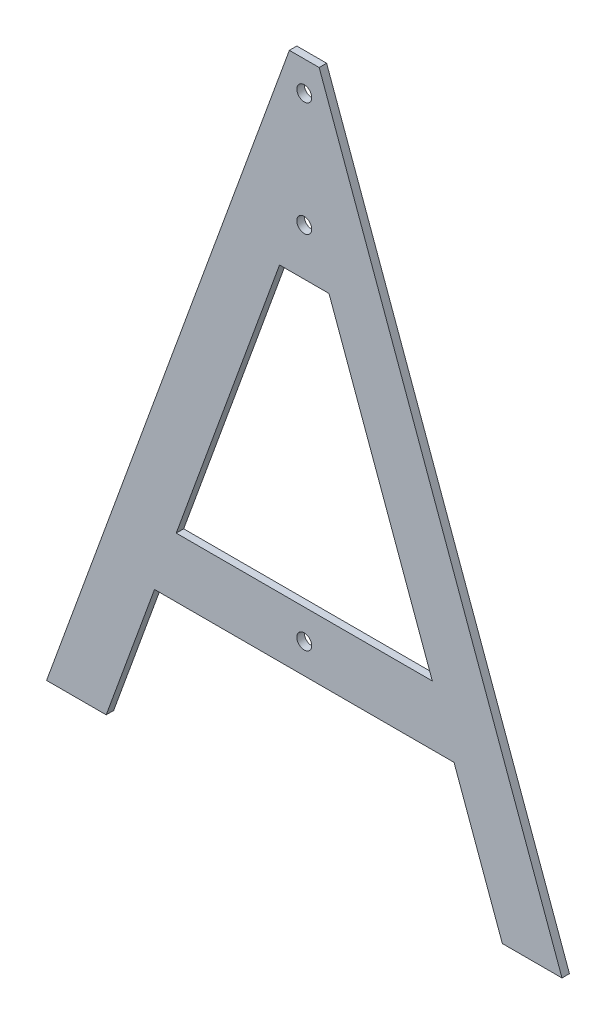
ISO-10303-21;
HEADER;
FILE_DESCRIPTION(('STEP AP214'),'2;1');
FILE_NAME('part.step','',(''),(''),'','','');
FILE_SCHEMA(('AUTOMOTIVE_DESIGN { 1 0 10303 214 1 1 1 1 }'));
ENDSEC;
DATA;
#1=APPLICATION_CONTEXT('core data for automotive mechanical design processes');
#2=APPLICATION_PROTOCOL_DEFINITION('international standard','automotive_design',2000,#1);
#3=PRODUCT_CONTEXT('',#1,'mechanical');
#4=PRODUCT('Part','Part','',(#3));
#5=PRODUCT_RELATED_PRODUCT_CATEGORY('part','',(#4));
#6=PRODUCT_DEFINITION_FORMATION('','',#4);
#7=PRODUCT_DEFINITION_CONTEXT('part definition',#1,'design');
#8=PRODUCT_DEFINITION('design','',#6,#7);
#9=PRODUCT_DEFINITION_SHAPE('','',#8);
#10=(LENGTH_UNIT() NAMED_UNIT(*) SI_UNIT(.MILLI.,.METRE.));
#11=(NAMED_UNIT(*) PLANE_ANGLE_UNIT() SI_UNIT($,.RADIAN.));
#12=(NAMED_UNIT(*) SI_UNIT($,.STERADIAN.) SOLID_ANGLE_UNIT());
#13=UNCERTAINTY_MEASURE_WITH_UNIT(LENGTH_MEASURE(1.E-05),#10,'distance_accuracy_value','');
#14=(GEOMETRIC_REPRESENTATION_CONTEXT(3) GLOBAL_UNCERTAINTY_ASSIGNED_CONTEXT((#13)) GLOBAL_UNIT_ASSIGNED_CONTEXT((#10,
#11,#12)) REPRESENTATION_CONTEXT('',''));
#15=CARTESIAN_POINT('',(0.,0.,0.));
#16=DIRECTION('',(0.,0.,1.));
#17=DIRECTION('',(1.,0.,0.));
#18=AXIS2_PLACEMENT_3D('',#15,#16,#17);
#19=CARTESIAN_POINT('',(0.,0.,3.175));
#20=DIRECTION('',(0.,0.,-1.));
#21=DIRECTION('',(-1.,0.,0.));
#22=AXIS2_PLACEMENT_3D('',#19,#20,#21);
#23=PLANE('',#22);
#24=CARTESIAN_POINT('',(0.,-48.55845,3.175));
#25=DIRECTION('',(0.,0.,1.));
#26=DIRECTION('',(1.,0.,0.));
#27=AXIS2_PLACEMENT_3D('',#24,#25,#26);
#28=CIRCLE('',#27,3.17500000000001);
#29=CARTESIAN_POINT('',(3.17500000000001,-48.55845,3.175));
#30=VERTEX_POINT('',#29);
#31=EDGE_CURVE('E180',#30,#30,#28,.T.);
#32=ORIENTED_EDGE('',*,*,#31,.F.);
#33=EDGE_LOOP('',(#32));
#34=FACE_BOUND('',#33,.T.);
#35=CARTESIAN_POINT('',(0.,0.,3.175));
#36=DIRECTION('',(0.,0.,1.));
#37=DIRECTION('',(1.,0.,0.));
#38=AXIS2_PLACEMENT_3D('',#35,#36,#37);
#39=CIRCLE('',#38,3.175);
#40=CARTESIAN_POINT('',(3.175,0.,3.175));
#41=VERTEX_POINT('',#40);
#42=EDGE_CURVE('E188',#41,#41,#39,.T.);
#43=ORIENTED_EDGE('',*,*,#42,.F.);
#44=EDGE_LOOP('',(#43));
#45=FACE_BOUND('',#44,.T.);
#46=DIRECTION('',(0.342020143325673,0.939692620785907,0.));
#47=VECTOR('',#46,1.);
#48=CARTESIAN_POINT('',(-84.3697580617083,-271.44345,3.175));
#49=LINE('',#48,#47);
#50=CARTESIAN_POINT('',(-84.3697580617083,-271.44345,3.175));
#51=VERTEX_POINT('',#50);
#52=CARTESIAN_POINT('',(-63.7859533311867,-214.889911296429,3.175));
#53=VERTEX_POINT('',#52);
#54=EDGE_CURVE('E196',#51,#53,#49,.T.);
#55=ORIENTED_EDGE('',*,*,#54,.T.);
#56=DIRECTION('',(1.,0.,0.));
#57=VECTOR('',#56,1.);
#58=CARTESIAN_POINT('',(-63.7859533311867,-214.889911296429,3.175));
#59=LINE('',#58,#57);
#60=CARTESIAN_POINT('',(63.7859533311867,-214.889911296429,3.175));
#61=VERTEX_POINT('',#60);
#62=EDGE_CURVE('E200',#53,#61,#59,.T.);
#63=ORIENTED_EDGE('',*,*,#62,.T.);
#64=DIRECTION('',(0.342020143325674,-0.939692620785907,0.));
#65=VECTOR('',#64,1.);
#66=CARTESIAN_POINT('',(84.3697580617084,-271.44345,3.175));
#67=LINE('',#66,#65);
#68=CARTESIAN_POINT('',(84.3697580617084,-271.44345,3.175));
#69=VERTEX_POINT('',#68);
#70=EDGE_CURVE('E204',#61,#69,#67,.T.);
#71=ORIENTED_EDGE('',*,*,#70,.T.);
#72=DIRECTION('',(1.,0.,0.));
#73=VECTOR('',#72,1.);
#74=CARTESIAN_POINT('',(109.769758061708,-271.44345,3.175));
#75=LINE('',#74,#73);
#76=CARTESIAN_POINT('',(109.769758061708,-271.44345,3.175));
#77=VERTEX_POINT('',#76);
#78=EDGE_CURVE('E207',#69,#77,#75,.T.);
#79=ORIENTED_EDGE('',*,*,#78,.T.);
#80=DIRECTION('',(-0.342020143325673,0.939692620785907,0.));
#81=VECTOR('',#80,1.);
#82=CARTESIAN_POINT('',(6.35,12.7,3.175));
#83=LINE('',#82,#81);
#84=CARTESIAN_POINT('',(6.35,12.7,3.175));
#85=VERTEX_POINT('',#84);
#86=EDGE_CURVE('E210',#77,#85,#83,.T.);
#87=ORIENTED_EDGE('',*,*,#86,.T.);
#88=DIRECTION('',(-1.,0.,0.));
#89=VECTOR('',#88,1.);
#90=CARTESIAN_POINT('',(6.35,12.7,3.175));
#91=LINE('',#90,#89);
#92=CARTESIAN_POINT('',(-6.35,12.7,3.175));
#93=VERTEX_POINT('',#92);
#94=EDGE_CURVE('E213',#85,#93,#91,.T.);
#95=ORIENTED_EDGE('',*,*,#94,.T.);
#96=DIRECTION('',(-0.342020143325673,-0.939692620785907,0.));
#97=VECTOR('',#96,1.);
#98=CARTESIAN_POINT('',(-6.35,12.7,3.175));
#99=LINE('',#98,#97);
#100=CARTESIAN_POINT('',(-109.769758061708,-271.44345,3.175));
#101=VERTEX_POINT('',#100);
#102=EDGE_CURVE('E216',#93,#101,#99,.T.);
#103=ORIENTED_EDGE('',*,*,#102,.T.);
#104=DIRECTION('',(1.,0.,0.));
#105=VECTOR('',#104,1.);
#106=CARTESIAN_POINT('',(-109.769758061708,-271.44345,3.175));
#107=LINE('',#106,#105);
#108=EDGE_CURVE('E219',#101,#51,#107,.T.);
#109=ORIENTED_EDGE('',*,*,#108,.T.);
#110=EDGE_LOOP('',(#55,#63,#71,#79,#87,#95,#103,#109));
#111=FACE_BOUND('',#110,.T.);
#112=DIRECTION('',(-1.,0.,0.));
#113=VECTOR('',#112,1.);
#114=CARTESIAN_POINT('',(-10.5276091176956,-68.5638131723228,3.175));
#115=LINE('',#114,#113);
#116=CARTESIAN_POINT('',(10.5276091176956,-68.5638131723228,3.175));
#117=VERTEX_POINT('',#116);
#118=CARTESIAN_POINT('',(-10.5276091176956,-68.5638131723228,3.175));
#119=VERTEX_POINT('',#118);
#120=EDGE_CURVE('E129',#117,#119,#115,.T.);
#121=ORIENTED_EDGE('',*,*,#120,.F.);
#122=DIRECTION('',(-0.342020143325673,0.939692620785907,0.));
#123=VECTOR('',#122,1.);
#124=CARTESIAN_POINT('',(54.5411093808251,-189.48991129643,3.175));
#125=LINE('',#124,#123);
#126=CARTESIAN_POINT('',(54.541109380825,-189.48991129643,3.175));
#127=VERTEX_POINT('',#126);
#128=EDGE_CURVE('E156',#127,#117,#125,.T.);
#129=ORIENTED_EDGE('',*,*,#128,.F.);
#130=DIRECTION('',(1.,0.,0.));
#131=VECTOR('',#130,1.);
#132=CARTESIAN_POINT('',(-54.541109380825,-189.48991129643,3.175));
#133=LINE('',#132,#131);
#134=CARTESIAN_POINT('',(-54.541109380825,-189.48991129643,3.175));
#135=VERTEX_POINT('',#134);
#136=EDGE_CURVE('E152',#135,#127,#133,.T.);
#137=ORIENTED_EDGE('',*,*,#136,.F.);
#138=DIRECTION('',(-0.342020143325672,-0.939692620785907,0.));
#139=VECTOR('',#138,1.);
#140=CARTESIAN_POINT('',(-54.541109380825,-189.48991129643,3.175));
#141=LINE('',#140,#139);
#142=EDGE_CURVE('E138',#119,#135,#141,.T.);
#143=ORIENTED_EDGE('',*,*,#142,.F.);
#144=EDGE_LOOP('',(#121,#129,#137,#143));
#145=FACE_BOUND('',#144,.T.);
#146=CARTESIAN_POINT('',(0.,-202.189911296429,3.175));
#147=DIRECTION('',(0.,0.,1.));
#148=DIRECTION('',(1.,0.,0.));
#149=AXIS2_PLACEMENT_3D('',#146,#147,#148);
#150=CIRCLE('',#149,3.17499999999999);
#151=CARTESIAN_POINT('',(3.17500000000001,-202.189911296429,3.175));
#152=VERTEX_POINT('',#151);
#153=EDGE_CURVE('E164',#152,#152,#150,.T.);
#154=ORIENTED_EDGE('',*,*,#153,.F.);
#155=EDGE_LOOP('',(#154));
#156=FACE_BOUND('',#155,.T.);
#157=ADVANCED_FACE('F39',(#34,#45,#111,#145,#156),#23,.F.);
#158=CARTESIAN_POINT('',(0.,0.,0.));
#159=DIRECTION('',(0.,0.,-1.));
#160=DIRECTION('',(-1.,0.,0.));
#161=AXIS2_PLACEMENT_3D('',#158,#159,#160);
#162=PLANE('',#161);
#163=DIRECTION('',(-0.342020143325673,0.939692620785907,0.));
#164=VECTOR('',#163,1.);
#165=CARTESIAN_POINT('',(54.5411093808251,-189.48991129643,0.));
#166=LINE('',#165,#164);
#167=CARTESIAN_POINT('',(54.5411093808251,-189.48991129643,0.));
#168=VERTEX_POINT('',#167);
#169=CARTESIAN_POINT('',(10.5276091176956,-68.5638131723228,0.));
#170=VERTEX_POINT('',#169);
#171=EDGE_CURVE('E139',#168,#170,#166,.T.);
#172=ORIENTED_EDGE('',*,*,#171,.T.);
#173=DIRECTION('',(-1.,0.,0.));
#174=VECTOR('',#173,1.);
#175=CARTESIAN_POINT('',(-10.5276091176956,-68.5638131723228,0.));
#176=LINE('',#175,#174);
#177=CARTESIAN_POINT('',(-10.5276091176956,-68.5638131723228,0.));
#178=VERTEX_POINT('',#177);
#179=EDGE_CURVE('E63',#170,#178,#176,.T.);
#180=ORIENTED_EDGE('',*,*,#179,.T.);
#181=DIRECTION('',(-0.342020143325672,-0.939692620785907,0.));
#182=VECTOR('',#181,1.);
#183=CARTESIAN_POINT('',(-54.541109380825,-189.48991129643,0.));
#184=LINE('',#183,#182);
#185=CARTESIAN_POINT('',(-54.541109380825,-189.48991129643,0.));
#186=VERTEX_POINT('',#185);
#187=EDGE_CURVE('E145',#178,#186,#184,.T.);
#188=ORIENTED_EDGE('',*,*,#187,.T.);
#189=DIRECTION('',(1.,0.,0.));
#190=VECTOR('',#189,1.);
#191=CARTESIAN_POINT('',(-54.541109380825,-189.48991129643,0.));
#192=LINE('',#191,#190);
#193=EDGE_CURVE('E167',#186,#168,#192,.T.);
#194=ORIENTED_EDGE('',*,*,#193,.T.);
#195=EDGE_LOOP('',(#172,#180,#188,#194));
#196=FACE_BOUND('',#195,.T.);
#197=CARTESIAN_POINT('',(0.,-48.55845,0.));
#198=DIRECTION('',(0.,0.,1.));
#199=DIRECTION('',(1.,0.,0.));
#200=AXIS2_PLACEMENT_3D('',#197,#198,#199);
#201=CIRCLE('',#200,3.17500000000001);
#202=CARTESIAN_POINT('',(3.17500000000001,-48.55845,0.));
#203=VERTEX_POINT('',#202);
#204=EDGE_CURVE('E147',#203,#203,#201,.T.);
#205=ORIENTED_EDGE('',*,*,#204,.T.);
#206=EDGE_LOOP('',(#205));
#207=FACE_BOUND('',#206,.T.);
#208=DIRECTION('',(0.342020143325673,0.939692620785907,0.));
#209=VECTOR('',#208,1.);
#210=CARTESIAN_POINT('',(-84.3697580617083,-271.44345,0.));
#211=LINE('',#210,#209);
#212=CARTESIAN_POINT('',(-84.3697580617083,-271.44345,0.));
#213=VERTEX_POINT('',#212);
#214=CARTESIAN_POINT('',(-63.7859533311867,-214.889911296429,0.));
#215=VERTEX_POINT('',#214);
#216=EDGE_CURVE('E192',#213,#215,#211,.T.);
#217=ORIENTED_EDGE('',*,*,#216,.F.);
#218=DIRECTION('',(1.,0.,0.));
#219=VECTOR('',#218,1.);
#220=CARTESIAN_POINT('',(-109.769758061708,-271.44345,0.));
#221=LINE('',#220,#219);
#222=CARTESIAN_POINT('',(-109.769758061708,-271.44345,0.));
#223=VERTEX_POINT('',#222);
#224=EDGE_CURVE('E201',#223,#213,#221,.T.);
#225=ORIENTED_EDGE('',*,*,#224,.F.);
#226=DIRECTION('',(-0.342020143325673,-0.939692620785907,0.));
#227=VECTOR('',#226,1.);
#228=CARTESIAN_POINT('',(-6.35,12.7,0.));
#229=LINE('',#228,#227);
#230=CARTESIAN_POINT('',(-6.35,12.7,0.));
#231=VERTEX_POINT('',#230);
#232=EDGE_CURVE('E241',#231,#223,#229,.T.);
#233=ORIENTED_EDGE('',*,*,#232,.F.);
#234=DIRECTION('',(-1.,0.,0.));
#235=VECTOR('',#234,1.);
#236=CARTESIAN_POINT('',(6.35,12.7,0.));
#237=LINE('',#236,#235);
#238=CARTESIAN_POINT('',(6.35,12.7,0.));
#239=VERTEX_POINT('',#238);
#240=EDGE_CURVE('E238',#239,#231,#237,.T.);
#241=ORIENTED_EDGE('',*,*,#240,.F.);
#242=DIRECTION('',(-0.342020143325673,0.939692620785907,0.));
#243=VECTOR('',#242,1.);
#244=CARTESIAN_POINT('',(6.35,12.7,0.));
#245=LINE('',#244,#243);
#246=CARTESIAN_POINT('',(109.769758061708,-271.44345,0.));
#247=VERTEX_POINT('',#246);
#248=EDGE_CURVE('E235',#247,#239,#245,.T.);
#249=ORIENTED_EDGE('',*,*,#248,.F.);
#250=DIRECTION('',(1.,0.,0.));
#251=VECTOR('',#250,1.);
#252=CARTESIAN_POINT('',(109.769758061708,-271.44345,0.));
#253=LINE('',#252,#251);
#254=CARTESIAN_POINT('',(84.3697580617084,-271.44345,0.));
#255=VERTEX_POINT('',#254);
#256=EDGE_CURVE('E232',#255,#247,#253,.T.);
#257=ORIENTED_EDGE('',*,*,#256,.F.);
#258=DIRECTION('',(0.342020143325674,-0.939692620785907,0.));
#259=VECTOR('',#258,1.);
#260=CARTESIAN_POINT('',(84.3697580617084,-271.44345,0.));
#261=LINE('',#260,#259);
#262=CARTESIAN_POINT('',(63.7859533311867,-214.889911296429,0.));
#263=VERTEX_POINT('',#262);
#264=EDGE_CURVE('E229',#263,#255,#261,.T.);
#265=ORIENTED_EDGE('',*,*,#264,.F.);
#266=DIRECTION('',(1.,0.,0.));
#267=VECTOR('',#266,1.);
#268=CARTESIAN_POINT('',(-63.7859533311867,-214.889911296429,0.));
#269=LINE('',#268,#267);
#270=EDGE_CURVE('E226',#215,#263,#269,.T.);
#271=ORIENTED_EDGE('',*,*,#270,.F.);
#272=EDGE_LOOP('',(#217,#225,#233,#241,#249,#257,#265,#271));
#273=FACE_BOUND('',#272,.T.);
#274=CARTESIAN_POINT('',(0.,0.,0.));
#275=DIRECTION('',(0.,0.,1.));
#276=DIRECTION('',(1.,0.,0.));
#277=AXIS2_PLACEMENT_3D('',#274,#275,#276);
#278=CIRCLE('',#277,3.175);
#279=CARTESIAN_POINT('',(3.175,0.,0.));
#280=VERTEX_POINT('',#279);
#281=EDGE_CURVE('E184',#280,#280,#278,.T.);
#282=ORIENTED_EDGE('',*,*,#281,.T.);
#283=EDGE_LOOP('',(#282));
#284=FACE_BOUND('',#283,.T.);
#285=CARTESIAN_POINT('',(0.,-202.189911296429,0.));
#286=DIRECTION('',(0.,0.,1.));
#287=DIRECTION('',(1.,0.,0.));
#288=AXIS2_PLACEMENT_3D('',#285,#286,#287);
#289=CIRCLE('',#288,3.17499999999999);
#290=CARTESIAN_POINT('',(3.17500000000001,-202.189911296429,0.));
#291=VERTEX_POINT('',#290);
#292=EDGE_CURVE('E349',#291,#291,#289,.T.);
#293=ORIENTED_EDGE('',*,*,#292,.T.);
#294=EDGE_LOOP('',(#293));
#295=FACE_BOUND('',#294,.T.);
#296=ADVANCED_FACE('F280',(#196,#207,#273,#284,#295),#162,.T.);
#297=CARTESIAN_POINT('',(-84.3697580617083,-271.44345,3.175));
#298=DIRECTION('',(-0.939692620785907,0.342020143325673,0.));
#299=DIRECTION('',(-0.342020143325673,-0.939692620785907,0.));
#300=AXIS2_PLACEMENT_3D('',#297,#298,#299);
#301=PLANE('',#300);
#302=ORIENTED_EDGE('',*,*,#216,.T.);
#303=DIRECTION('',(0.,0.,-1.));
#304=VECTOR('',#303,1.);
#305=CARTESIAN_POINT('',(-63.7859533311867,-214.889911296429,3.175));
#306=LINE('',#305,#304);
#307=EDGE_CURVE('E11',#53,#215,#306,.T.);
#308=ORIENTED_EDGE('',*,*,#307,.F.);
#309=ORIENTED_EDGE('',*,*,#54,.F.);
#310=DIRECTION('',(0.,0.,-1.));
#311=VECTOR('',#310,1.);
#312=CARTESIAN_POINT('',(-84.3697580617083,-271.44345,3.175));
#313=LINE('',#312,#311);
#314=EDGE_CURVE('E222',#51,#213,#313,.T.);
#315=ORIENTED_EDGE('',*,*,#314,.T.);
#316=EDGE_LOOP('',(#302,#308,#309,#315));
#317=FACE_BOUND('',#316,.T.);
#318=ADVANCED_FACE('F41',(#317),#301,.F.);
#319=CARTESIAN_POINT('',(-63.7859533311867,-214.889911296429,3.175));
#320=DIRECTION('',(0.,1.,0.));
#321=DIRECTION('',(-1.,0.,0.));
#322=AXIS2_PLACEMENT_3D('',#319,#320,#321);
#323=PLANE('',#322);
#324=ORIENTED_EDGE('',*,*,#270,.T.);
#325=DIRECTION('',(0.,0.,-1.));
#326=VECTOR('',#325,1.);
#327=CARTESIAN_POINT('',(63.7859533311867,-214.889911296429,3.175));
#328=LINE('',#327,#326);
#329=EDGE_CURVE('E48',#61,#263,#328,.T.);
#330=ORIENTED_EDGE('',*,*,#329,.F.);
#331=ORIENTED_EDGE('',*,*,#62,.F.);
#332=ORIENTED_EDGE('',*,*,#307,.T.);
#333=EDGE_LOOP('',(#324,#330,#331,#332));
#334=FACE_BOUND('',#333,.T.);
#335=ADVANCED_FACE('F297',(#334),#323,.F.);
#336=CARTESIAN_POINT('',(84.3697580617084,-271.44345,3.175));
#337=DIRECTION('',(0.939692620785906,0.342020143325674,0.));
#338=DIRECTION('',(-0.342020143325674,0.939692620785907,0.));
#339=AXIS2_PLACEMENT_3D('',#336,#337,#338);
#340=PLANE('',#339);
#341=ORIENTED_EDGE('',*,*,#264,.T.);
#342=DIRECTION('',(0.,0.,-1.));
#343=VECTOR('',#342,1.);
#344=CARTESIAN_POINT('',(84.3697580617084,-271.44345,3.175));
#345=LINE('',#344,#343);
#346=EDGE_CURVE('E265',#69,#255,#345,.T.);
#347=ORIENTED_EDGE('',*,*,#346,.F.);
#348=ORIENTED_EDGE('',*,*,#70,.F.);
#349=ORIENTED_EDGE('',*,*,#329,.T.);
#350=EDGE_LOOP('',(#341,#347,#348,#349));
#351=FACE_BOUND('',#350,.T.);
#352=ADVANCED_FACE('F274',(#351),#340,.F.);
#353=CARTESIAN_POINT('',(109.769758061708,-271.44345,3.175));
#354=DIRECTION('',(0.,1.,0.));
#355=DIRECTION('',(-1.,0.,0.));
#356=AXIS2_PLACEMENT_3D('',#353,#354,#355);
#357=PLANE('',#356);
#358=ORIENTED_EDGE('',*,*,#256,.T.);
#359=DIRECTION('',(0.,0.,-1.));
#360=VECTOR('',#359,1.);
#361=CARTESIAN_POINT('',(109.769758061708,-271.44345,3.175));
#362=LINE('',#361,#360);
#363=EDGE_CURVE('E261',#77,#247,#362,.T.);
#364=ORIENTED_EDGE('',*,*,#363,.F.);
#365=ORIENTED_EDGE('',*,*,#78,.F.);
#366=ORIENTED_EDGE('',*,*,#346,.T.);
#367=EDGE_LOOP('',(#358,#364,#365,#366));
#368=FACE_BOUND('',#367,.T.);
#369=ADVANCED_FACE('F286',(#368),#357,.F.);
#370=CARTESIAN_POINT('',(6.35,12.7,3.175));
#371=DIRECTION('',(-0.939692620785907,-0.342020143325673,0.));
#372=DIRECTION('',(0.342020143325673,-0.939692620785907,0.));
#373=AXIS2_PLACEMENT_3D('',#370,#371,#372);
#374=PLANE('',#373);
#375=ORIENTED_EDGE('',*,*,#248,.T.);
#376=DIRECTION('',(0.,0.,-1.));
#377=VECTOR('',#376,1.);
#378=CARTESIAN_POINT('',(6.35,12.7,3.175));
#379=LINE('',#378,#377);
#380=EDGE_CURVE('E257',#85,#239,#379,.T.);
#381=ORIENTED_EDGE('',*,*,#380,.F.);
#382=ORIENTED_EDGE('',*,*,#86,.F.);
#383=ORIENTED_EDGE('',*,*,#363,.T.);
#384=EDGE_LOOP('',(#375,#381,#382,#383));
#385=FACE_BOUND('',#384,.T.);
#386=ADVANCED_FACE('F290',(#385),#374,.F.);
#387=CARTESIAN_POINT('',(6.35,12.7,3.175));
#388=DIRECTION('',(0.,-1.,0.));
#389=DIRECTION('',(1.,0.,0.));
#390=AXIS2_PLACEMENT_3D('',#387,#388,#389);
#391=PLANE('',#390);
#392=ORIENTED_EDGE('',*,*,#240,.T.);
#393=DIRECTION('',(0.,0.,-1.));
#394=VECTOR('',#393,1.);
#395=CARTESIAN_POINT('',(-6.35,12.7,3.175));
#396=LINE('',#395,#394);
#397=EDGE_CURVE('E253',#93,#231,#396,.T.);
#398=ORIENTED_EDGE('',*,*,#397,.F.);
#399=ORIENTED_EDGE('',*,*,#94,.F.);
#400=ORIENTED_EDGE('',*,*,#380,.T.);
#401=EDGE_LOOP('',(#392,#398,#399,#400));
#402=FACE_BOUND('',#401,.T.);
#403=ADVANCED_FACE('F310',(#402),#391,.F.);
#404=CARTESIAN_POINT('',(-6.35,12.7,3.175));
#405=DIRECTION('',(0.939692620785907,-0.342020143325673,0.));
#406=DIRECTION('',(0.342020143325673,0.939692620785907,0.));
#407=AXIS2_PLACEMENT_3D('',#404,#405,#406);
#408=PLANE('',#407);
#409=ORIENTED_EDGE('',*,*,#232,.T.);
#410=DIRECTION('',(0.,0.,-1.));
#411=VECTOR('',#410,1.);
#412=CARTESIAN_POINT('',(-109.769758061708,-271.44345,3.175));
#413=LINE('',#412,#411);
#414=EDGE_CURVE('E249',#101,#223,#413,.T.);
#415=ORIENTED_EDGE('',*,*,#414,.F.);
#416=ORIENTED_EDGE('',*,*,#102,.F.);
#417=ORIENTED_EDGE('',*,*,#397,.T.);
#418=EDGE_LOOP('',(#409,#415,#416,#417));
#419=FACE_BOUND('',#418,.T.);
#420=ADVANCED_FACE('F308',(#419),#408,.F.);
#421=CARTESIAN_POINT('',(-109.769758061708,-271.44345,3.175));
#422=DIRECTION('',(0.,1.,0.));
#423=DIRECTION('',(-1.,0.,0.));
#424=AXIS2_PLACEMENT_3D('',#421,#422,#423);
#425=PLANE('',#424);
#426=ORIENTED_EDGE('',*,*,#224,.T.);
#427=ORIENTED_EDGE('',*,*,#314,.F.);
#428=ORIENTED_EDGE('',*,*,#108,.F.);
#429=ORIENTED_EDGE('',*,*,#414,.T.);
#430=EDGE_LOOP('',(#426,#427,#428,#429));
#431=FACE_BOUND('',#430,.T.);
#432=ADVANCED_FACE('F303',(#431),#425,.F.);
#433=CARTESIAN_POINT('',(0.,0.,3.175));
#434=DIRECTION('',(0.,0.,-1.));
#435=DIRECTION('',(-1.,0.,0.));
#436=AXIS2_PLACEMENT_3D('',#433,#434,#435);
#437=CYLINDRICAL_SURFACE('',#436,3.175);
#438=ORIENTED_EDGE('',*,*,#42,.T.);
#439=EDGE_LOOP('',(#438));
#440=FACE_BOUND('',#439,.T.);
#441=ORIENTED_EDGE('',*,*,#281,.F.);
#442=EDGE_LOOP('',(#441));
#443=FACE_BOUND('',#442,.T.);
#444=ADVANCED_FACE('F330',(#440,#443),#437,.F.);
#445=CARTESIAN_POINT('',(0.,-48.55845,3.175));
#446=DIRECTION('',(0.,0.,-1.));
#447=DIRECTION('',(-1.,0.,0.));
#448=AXIS2_PLACEMENT_3D('',#445,#446,#447);
#449=CYLINDRICAL_SURFACE('',#448,3.17500000000001);
#450=ORIENTED_EDGE('',*,*,#31,.T.);
#451=EDGE_LOOP('',(#450));
#452=FACE_BOUND('',#451,.T.);
#453=ORIENTED_EDGE('',*,*,#204,.F.);
#454=EDGE_LOOP('',(#453));
#455=FACE_BOUND('',#454,.T.);
#456=ADVANCED_FACE('F337',(#452,#455),#449,.F.);
#457=CARTESIAN_POINT('',(-10.5276091176956,-68.5638131723228,3.175));
#458=DIRECTION('',(0.,-1.,0.));
#459=DIRECTION('',(0.,0.,-1.));
#460=AXIS2_PLACEMENT_3D('',#457,#458,#459);
#461=PLANE('',#460);
#462=ORIENTED_EDGE('',*,*,#179,.F.);
#463=DIRECTION('',(0.,0.,-1.));
#464=VECTOR('',#463,1.);
#465=CARTESIAN_POINT('',(10.5276091176956,-68.5638131723228,3.175));
#466=LINE('',#465,#464);
#467=EDGE_CURVE('E133',#117,#170,#466,.T.);
#468=ORIENTED_EDGE('',*,*,#467,.F.);
#469=ORIENTED_EDGE('',*,*,#120,.T.);
#470=DIRECTION('',(0.,0.,-1.));
#471=VECTOR('',#470,1.);
#472=CARTESIAN_POINT('',(-10.5276091176956,-68.5638131723228,3.175));
#473=LINE('',#472,#471);
#474=EDGE_CURVE('E132',#119,#178,#473,.T.);
#475=ORIENTED_EDGE('',*,*,#474,.T.);
#476=EDGE_LOOP('',(#462,#468,#469,#475));
#477=FACE_BOUND('',#476,.T.);
#478=ADVANCED_FACE('F131',(#477),#461,.T.);
#479=CARTESIAN_POINT('',(-54.541109380825,-189.48991129643,3.175));
#480=DIRECTION('',(0.939692620785907,-0.342020143325672,0.));
#481=DIRECTION('',(0.342020143325672,0.939692620785907,0.));
#482=AXIS2_PLACEMENT_3D('',#479,#480,#481);
#483=PLANE('',#482);
#484=ORIENTED_EDGE('',*,*,#187,.F.);
#485=ORIENTED_EDGE('',*,*,#474,.F.);
#486=ORIENTED_EDGE('',*,*,#142,.T.);
#487=DIRECTION('',(0.,0.,-1.));
#488=VECTOR('',#487,1.);
#489=CARTESIAN_POINT('',(-54.541109380825,-189.48991129643,3.175));
#490=LINE('',#489,#488);
#491=EDGE_CURVE('E148',#135,#186,#490,.T.);
#492=ORIENTED_EDGE('',*,*,#491,.T.);
#493=EDGE_LOOP('',(#484,#485,#486,#492));
#494=FACE_BOUND('',#493,.T.);
#495=ADVANCED_FACE('F142',(#494),#483,.T.);
#496=CARTESIAN_POINT('',(-54.541109380825,-189.48991129643,3.175));
#497=DIRECTION('',(0.,1.,0.));
#498=DIRECTION('',(0.,0.,1.));
#499=AXIS2_PLACEMENT_3D('',#496,#497,#498);
#500=PLANE('',#499);
#501=ORIENTED_EDGE('',*,*,#193,.F.);
#502=ORIENTED_EDGE('',*,*,#491,.F.);
#503=ORIENTED_EDGE('',*,*,#136,.T.);
#504=DIRECTION('',(0.,0.,-1.));
#505=VECTOR('',#504,1.);
#506=CARTESIAN_POINT('',(54.5411093808251,-189.48991129643,3.175));
#507=LINE('',#506,#505);
#508=EDGE_CURVE('E55',#127,#168,#507,.T.);
#509=ORIENTED_EDGE('',*,*,#508,.T.);
#510=EDGE_LOOP('',(#501,#502,#503,#509));
#511=FACE_BOUND('',#510,.T.);
#512=ADVANCED_FACE('F364',(#511),#500,.T.);
#513=CARTESIAN_POINT('',(54.5411093808251,-189.48991129643,3.175));
#514=DIRECTION('',(-0.939692620785907,-0.342020143325673,0.));
#515=DIRECTION('',(0.342020143325673,-0.939692620785907,0.));
#516=AXIS2_PLACEMENT_3D('',#513,#514,#515);
#517=PLANE('',#516);
#518=ORIENTED_EDGE('',*,*,#171,.F.);
#519=ORIENTED_EDGE('',*,*,#508,.F.);
#520=ORIENTED_EDGE('',*,*,#128,.T.);
#521=ORIENTED_EDGE('',*,*,#467,.T.);
#522=EDGE_LOOP('',(#518,#519,#520,#521));
#523=FACE_BOUND('',#522,.T.);
#524=ADVANCED_FACE('F359',(#523),#517,.T.);
#525=CARTESIAN_POINT('',(0.,-202.189911296429,3.175));
#526=DIRECTION('',(0.,0.,-1.));
#527=DIRECTION('',(-1.,0.,0.));
#528=AXIS2_PLACEMENT_3D('',#525,#526,#527);
#529=CYLINDRICAL_SURFACE('',#528,3.17499999999999);
#530=ORIENTED_EDGE('',*,*,#153,.T.);
#531=EDGE_LOOP('',(#530));
#532=FACE_BOUND('',#531,.T.);
#533=ORIENTED_EDGE('',*,*,#292,.F.);
#534=EDGE_LOOP('',(#533));
#535=FACE_BOUND('',#534,.T.);
#536=ADVANCED_FACE('F357',(#532,#535),#529,.F.);
#537=CLOSED_SHELL('',(#157,#296,#318,#335,#352,#369,#386,#403,#420,#432,#444,#456,#478,#495,
#512,#524,#536));
#538=MANIFOLD_SOLID_BREP('B2',#537);
#539=ADVANCED_BREP_SHAPE_REPRESENTATION('',(#18,#538),#14);
#540=SHAPE_DEFINITION_REPRESENTATION(#9,#539);
ENDSEC;
END-ISO-10303-21;
